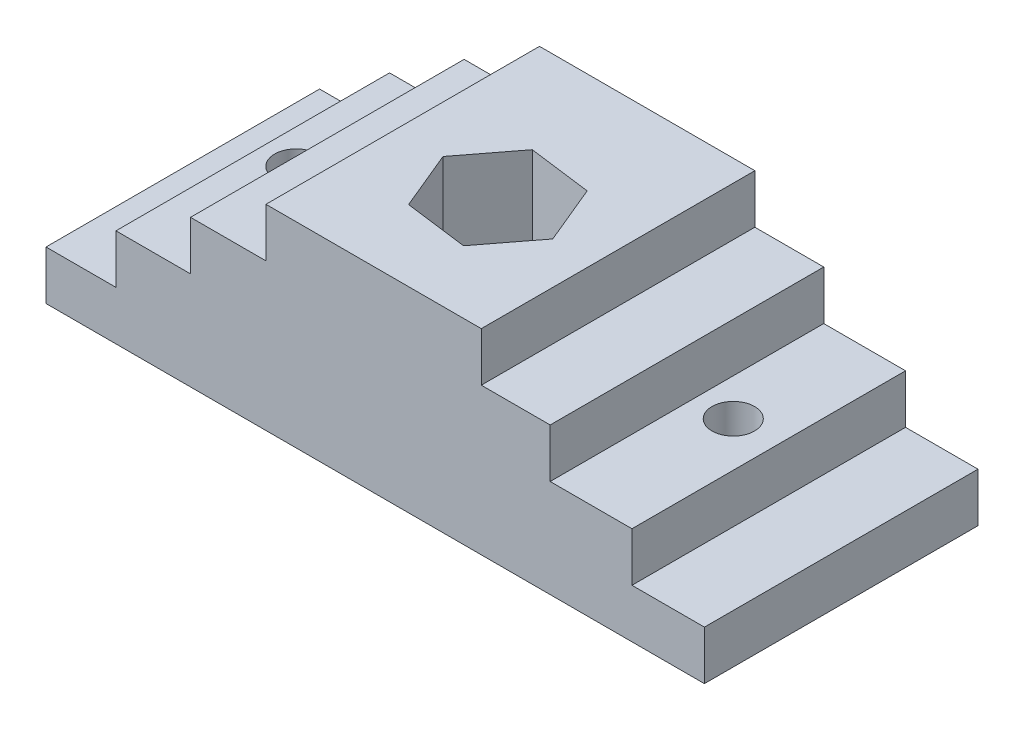
ISO-10303-21;
HEADER;
FILE_DESCRIPTION(('STEP AP214'),'2;1');
FILE_NAME('part.step','',(''),(''),'','','');
FILE_SCHEMA(('AUTOMOTIVE_DESIGN { 1 0 10303 214 1 1 1 1 }'));
ENDSEC;
DATA;
#1=APPLICATION_CONTEXT('core data for automotive mechanical design processes');
#2=APPLICATION_PROTOCOL_DEFINITION('international standard','automotive_design',2000,#1);
#3=PRODUCT_CONTEXT('',#1,'mechanical');
#4=PRODUCT('Part','Part','',(#3));
#5=PRODUCT_RELATED_PRODUCT_CATEGORY('part','',(#4));
#6=PRODUCT_DEFINITION_FORMATION('','',#4);
#7=PRODUCT_DEFINITION_CONTEXT('part definition',#1,'design');
#8=PRODUCT_DEFINITION('design','',#6,#7);
#9=PRODUCT_DEFINITION_SHAPE('','',#8);
#10=(LENGTH_UNIT() NAMED_UNIT(*) SI_UNIT(.MILLI.,.METRE.));
#11=(NAMED_UNIT(*) PLANE_ANGLE_UNIT() SI_UNIT($,.RADIAN.));
#12=(NAMED_UNIT(*) SI_UNIT($,.STERADIAN.) SOLID_ANGLE_UNIT());
#13=UNCERTAINTY_MEASURE_WITH_UNIT(LENGTH_MEASURE(1.E-05),#10,'distance_accuracy_value','');
#14=(GEOMETRIC_REPRESENTATION_CONTEXT(3) GLOBAL_UNCERTAINTY_ASSIGNED_CONTEXT((#13)) GLOBAL_UNIT_ASSIGNED_CONTEXT((#10,
#11,#12)) REPRESENTATION_CONTEXT('',''));
#15=CARTESIAN_POINT('',(0.,0.,0.));
#16=DIRECTION('',(0.,0.,1.));
#17=DIRECTION('',(1.,0.,0.));
#18=AXIS2_PLACEMENT_3D('',#15,#16,#17);
#19=CARTESIAN_POINT('',(0.,60.,0.));
#20=DIRECTION('',(0.,1.,0.));
#21=DIRECTION('',(0.,0.,1.));
#22=AXIS2_PLACEMENT_3D('',#19,#20,#21);
#23=PLANE('',#22);
#24=DIRECTION('',(0.,0.,1.));
#25=VECTOR('',#24,1.);
#26=CARTESIAN_POINT('',(-31.7393175950065,60.,-55.0411341898475));
#27=LINE('',#26,#25);
#28=CARTESIAN_POINT('',(-31.7393175950065,60.,-55.0411341898475));
#29=VERTEX_POINT('',#28);
#30=CARTESIAN_POINT('',(-31.7393175950065,60.,56.6780452438207));
#31=VERTEX_POINT('',#30);
#32=EDGE_CURVE('E243',#29,#31,#27,.T.);
#33=ORIENTED_EDGE('',*,*,#32,.F.);
#34=DIRECTION('',(-1.,0.,0.));
#35=VECTOR('',#34,1.);
#36=CARTESIAN_POINT('',(-62.5244053726272,60.,-55.0411341898475));
#37=LINE('',#36,#35);
#38=CARTESIAN_POINT('',(-62.5244053726272,60.,-55.0411341898475));
#39=VERTEX_POINT('',#38);
#40=EDGE_CURVE('E282',#29,#39,#37,.T.);
#41=ORIENTED_EDGE('',*,*,#40,.T.);
#42=DIRECTION('',(0.,0.,1.));
#43=VECTOR('',#42,1.);
#44=CARTESIAN_POINT('',(-62.5244053726272,60.,-55.0411341898475));
#45=LINE('',#44,#43);
#46=CARTESIAN_POINT('',(-62.5244053726272,60.,56.6780452438207));
#47=VERTEX_POINT('',#46);
#48=EDGE_CURVE('E273',#39,#47,#45,.T.);
#49=ORIENTED_EDGE('',*,*,#48,.T.);
#50=DIRECTION('',(1.,0.,0.));
#51=VECTOR('',#50,1.);
#52=CARTESIAN_POINT('',(-62.5244053726272,60.,56.6780452438207));
#53=LINE('',#52,#51);
#54=EDGE_CURVE('E278',#47,#31,#53,.T.);
#55=ORIENTED_EDGE('',*,*,#54,.T.);
#56=EDGE_LOOP('',(#33,#41,#49,#55));
#57=FACE_BOUND('',#56,.T.);
#58=ADVANCED_FACE('F32',(#57),#23,.T.);
#59=CARTESIAN_POINT('',(0.,40.,0.));
#60=DIRECTION('',(0.,1.,0.));
#61=DIRECTION('',(0.,0.,1.));
#62=AXIS2_PLACEMENT_3D('',#59,#60,#61);
#63=PLANE('',#62);
#64=CARTESIAN_POINT('',(-78.9946033956425,40.,-2.9007104851005));
#65=DIRECTION('',(0.,1.,0.));
#66=DIRECTION('',(0.,0.,1.));
#67=AXIS2_PLACEMENT_3D('',#64,#65,#66);
#68=CIRCLE('',#67,8.75097885196963);
#69=CARTESIAN_POINT('',(-78.9946033956425,40.,5.85026836686913));
#70=VERTEX_POINT('',#69);
#71=EDGE_CURVE('E237',#70,#70,#68,.T.);
#72=ORIENTED_EDGE('',*,*,#71,.F.);
#73=EDGE_LOOP('',(#72));
#74=FACE_BOUND('',#73,.T.);
#75=DIRECTION('',(0.,0.,1.));
#76=VECTOR('',#75,1.);
#77=CARTESIAN_POINT('',(-62.5244053726272,40.,-55.0411341898475));
#78=LINE('',#77,#76);
#79=CARTESIAN_POINT('',(-62.5244053726272,40.,-55.0411341898475));
#80=VERTEX_POINT('',#79);
#81=CARTESIAN_POINT('',(-62.5244053726272,40.,56.6780452438207));
#82=VERTEX_POINT('',#81);
#83=EDGE_CURVE('E272',#80,#82,#78,.T.);
#84=ORIENTED_EDGE('',*,*,#83,.F.);
#85=DIRECTION('',(-1.,0.,0.));
#86=VECTOR('',#85,1.);
#87=CARTESIAN_POINT('',(-92.976988235667,40.,-55.0411341898475));
#88=LINE('',#87,#86);
#89=CARTESIAN_POINT('',(-92.976988235667,40.,-55.0411341898475));
#90=VERTEX_POINT('',#89);
#91=EDGE_CURVE('E311',#80,#90,#88,.T.);
#92=ORIENTED_EDGE('',*,*,#91,.T.);
#93=DIRECTION('',(0.,0.,1.));
#94=VECTOR('',#93,1.);
#95=CARTESIAN_POINT('',(-92.976988235667,40.,-55.0411341898475));
#96=LINE('',#95,#94);
#97=CARTESIAN_POINT('',(-92.976988235667,40.,56.6780452438207));
#98=VERTEX_POINT('',#97);
#99=EDGE_CURVE('E302',#90,#98,#96,.T.);
#100=ORIENTED_EDGE('',*,*,#99,.T.);
#101=DIRECTION('',(1.,0.,0.));
#102=VECTOR('',#101,1.);
#103=CARTESIAN_POINT('',(-92.976988235667,40.,56.6780452438207));
#104=LINE('',#103,#102);
#105=EDGE_CURVE('E307',#98,#82,#104,.T.);
#106=ORIENTED_EDGE('',*,*,#105,.T.);
#107=EDGE_LOOP('',(#84,#92,#100,#106));
#108=FACE_BOUND('',#107,.T.);
#109=ADVANCED_FACE('F384',(#74,#108),#63,.T.);
#110=CARTESIAN_POINT('',(0.,20.,0.));
#111=DIRECTION('',(0.,1.,0.));
#112=DIRECTION('',(0.,0.,1.));
#113=AXIS2_PLACEMENT_3D('',#110,#111,#112);
#114=PLANE('',#113);
#115=DIRECTION('',(0.,0.,1.));
#116=VECTOR('',#115,1.);
#117=CARTESIAN_POINT('',(-92.976988235667,20.,-55.0411341898475));
#118=LINE('',#117,#116);
#119=CARTESIAN_POINT('',(-92.976988235667,20.,-55.0411341898475));
#120=VERTEX_POINT('',#119);
#121=CARTESIAN_POINT('',(-92.976988235667,20.,56.6780452438207));
#122=VERTEX_POINT('',#121);
#123=EDGE_CURVE('E301',#120,#122,#118,.T.);
#124=ORIENTED_EDGE('',*,*,#123,.F.);
#125=DIRECTION('',(-1.,0.,0.));
#126=VECTOR('',#125,1.);
#127=CARTESIAN_POINT('',(-121.540645757507,20.,-55.0411341898475));
#128=LINE('',#127,#126);
#129=CARTESIAN_POINT('',(-121.540645757507,20.,-55.0411341898475));
#130=VERTEX_POINT('',#129);
#131=EDGE_CURVE('E340',#120,#130,#128,.T.);
#132=ORIENTED_EDGE('',*,*,#131,.T.);
#133=DIRECTION('',(0.,0.,1.));
#134=VECTOR('',#133,1.);
#135=CARTESIAN_POINT('',(-121.540645757507,20.,-55.0411341898475));
#136=LINE('',#135,#134);
#137=CARTESIAN_POINT('',(-121.540645757507,20.,56.6780452438207));
#138=VERTEX_POINT('',#137);
#139=EDGE_CURVE('E331',#130,#138,#136,.T.);
#140=ORIENTED_EDGE('',*,*,#139,.T.);
#141=DIRECTION('',(1.,0.,0.));
#142=VECTOR('',#141,1.);
#143=CARTESIAN_POINT('',(-121.540645757507,20.,56.6780452438207));
#144=LINE('',#143,#142);
#145=EDGE_CURVE('E336',#138,#122,#144,.T.);
#146=ORIENTED_EDGE('',*,*,#145,.T.);
#147=EDGE_LOOP('',(#124,#132,#140,#146));
#148=FACE_BOUND('',#147,.T.);
#149=ADVANCED_FACE('F376',(#148),#114,.T.);
#150=CARTESIAN_POINT('',(-121.540645757507,20.,-55.0411341898475));
#151=DIRECTION('',(1.,0.,0.));
#152=DIRECTION('',(0.,0.,-1.));
#153=AXIS2_PLACEMENT_3D('',#150,#151,#152);
#154=PLANE('',#153);
#155=DIRECTION('',(0.,0.,1.));
#156=VECTOR('',#155,1.);
#157=CARTESIAN_POINT('',(-121.540645757507,0.,-55.0411341898475));
#158=LINE('',#157,#156);
#159=CARTESIAN_POINT('',(-121.540645757507,0.,-55.0411341898475));
#160=VERTEX_POINT('',#159);
#161=CARTESIAN_POINT('',(-121.540645757507,0.,56.6780452438207));
#162=VERTEX_POINT('',#161);
#163=EDGE_CURVE('E330',#160,#162,#158,.T.);
#164=ORIENTED_EDGE('',*,*,#163,.T.);
#165=DIRECTION('',(0.,-1.,0.));
#166=VECTOR('',#165,1.);
#167=CARTESIAN_POINT('',(-121.540645757507,20.,56.6780452438207));
#168=LINE('',#167,#166);
#169=EDGE_CURVE('E11',#138,#162,#168,.T.);
#170=ORIENTED_EDGE('',*,*,#169,.F.);
#171=ORIENTED_EDGE('',*,*,#139,.F.);
#172=DIRECTION('',(0.,-1.,0.));
#173=VECTOR('',#172,1.);
#174=CARTESIAN_POINT('',(-121.540645757507,20.,-55.0411341898475));
#175=LINE('',#174,#173);
#176=EDGE_CURVE('E343',#130,#160,#175,.T.);
#177=ORIENTED_EDGE('',*,*,#176,.T.);
#178=EDGE_LOOP('',(#164,#170,#171,#177));
#179=FACE_BOUND('',#178,.T.);
#180=ADVANCED_FACE('F34',(#179),#154,.F.);
#181=CARTESIAN_POINT('',(-121.540645757507,20.,56.6780452438207));
#182=DIRECTION('',(0.,0.,-1.));
#183=DIRECTION('',(-1.,0.,0.));
#184=AXIS2_PLACEMENT_3D('',#181,#182,#183);
#185=PLANE('',#184);
#186=DIRECTION('',(1.,0.,0.));
#187=VECTOR('',#186,1.);
#188=CARTESIAN_POINT('',(-121.540645757507,0.,56.6780452438207));
#189=LINE('',#188,#187);
#190=CARTESIAN_POINT('',(147.321994857585,0.,56.6780452438207));
#191=VERTEX_POINT('',#190);
#192=EDGE_CURVE('E346',#162,#191,#189,.T.);
#193=ORIENTED_EDGE('',*,*,#192,.T.);
#194=DIRECTION('',(0.,-1.,0.));
#195=VECTOR('',#194,1.);
#196=CARTESIAN_POINT('',(147.321994857585,20.,56.6780452438207));
#197=LINE('',#196,#195);
#198=CARTESIAN_POINT('',(147.321994857585,20.,56.6780452438207));
#199=VERTEX_POINT('',#198);
#200=EDGE_CURVE('E40',#199,#191,#197,.T.);
#201=ORIENTED_EDGE('',*,*,#200,.F.);
#202=CARTESIAN_POINT('',(117.735238348915,20.,56.6780452438207));
#203=VERTEX_POINT('',#202);
#204=EDGE_CURVE('E334',#203,#199,#144,.T.);
#205=ORIENTED_EDGE('',*,*,#204,.F.);
#206=DIRECTION('',(0.,-1.,0.));
#207=VECTOR('',#206,1.);
#208=CARTESIAN_POINT('',(117.735238348915,40.,56.6780452438207));
#209=LINE('',#208,#207);
#210=CARTESIAN_POINT('',(117.735238348915,40.,56.6780452438207));
#211=VERTEX_POINT('',#210);
#212=EDGE_CURVE('E324',#211,#203,#209,.T.);
#213=ORIENTED_EDGE('',*,*,#212,.F.);
#214=CARTESIAN_POINT('',(84.335631337839,40.,56.6780452438207));
#215=VERTEX_POINT('',#214);
#216=EDGE_CURVE('E305',#215,#211,#104,.T.);
#217=ORIENTED_EDGE('',*,*,#216,.F.);
#218=DIRECTION('',(0.,-1.,0.));
#219=VECTOR('',#218,1.);
#220=CARTESIAN_POINT('',(84.335631337839,60.,56.6780452438207));
#221=LINE('',#220,#219);
#222=CARTESIAN_POINT('',(84.335631337839,60.,56.6780452438207));
#223=VERTEX_POINT('',#222);
#224=EDGE_CURVE('E295',#223,#215,#221,.T.);
#225=ORIENTED_EDGE('',*,*,#224,.F.);
#226=CARTESIAN_POINT('',(56.2080198672883,60.,56.6780452438207));
#227=VERTEX_POINT('',#226);
#228=EDGE_CURVE('E276',#227,#223,#53,.T.);
#229=ORIENTED_EDGE('',*,*,#228,.F.);
#230=DIRECTION('',(0.,-1.,0.));
#231=VECTOR('',#230,1.);
#232=CARTESIAN_POINT('',(56.2080198672883,80.,56.6780452438207));
#233=LINE('',#232,#231);
#234=CARTESIAN_POINT('',(56.2080198672883,80.,56.6780452438207));
#235=VERTEX_POINT('',#234);
#236=EDGE_CURVE('E266',#235,#227,#233,.T.);
#237=ORIENTED_EDGE('',*,*,#236,.F.);
#238=DIRECTION('',(1.,0.,0.));
#239=VECTOR('',#238,1.);
#240=CARTESIAN_POINT('',(-31.7393175950065,80.,56.6780452438207));
#241=LINE('',#240,#239);
#242=CARTESIAN_POINT('',(-31.7393175950065,80.,56.6780452438207));
#243=VERTEX_POINT('',#242);
#244=EDGE_CURVE('E249',#243,#235,#241,.T.);
#245=ORIENTED_EDGE('',*,*,#244,.F.);
#246=DIRECTION('',(0.,-1.,0.));
#247=VECTOR('',#246,1.);
#248=CARTESIAN_POINT('',(-31.7393175950065,80.,56.6780452438207));
#249=LINE('',#248,#247);
#250=EDGE_CURVE('E269',#243,#31,#249,.T.);
#251=ORIENTED_EDGE('',*,*,#250,.T.);
#252=ORIENTED_EDGE('',*,*,#54,.F.);
#253=DIRECTION('',(0.,-1.,0.));
#254=VECTOR('',#253,1.);
#255=CARTESIAN_POINT('',(-62.5244053726272,60.,56.6780452438207));
#256=LINE('',#255,#254);
#257=EDGE_CURVE('E298',#47,#82,#256,.T.);
#258=ORIENTED_EDGE('',*,*,#257,.T.);
#259=ORIENTED_EDGE('',*,*,#105,.F.);
#260=DIRECTION('',(0.,-1.,0.));
#261=VECTOR('',#260,1.);
#262=CARTESIAN_POINT('',(-92.976988235667,40.,56.6780452438207));
#263=LINE('',#262,#261);
#264=EDGE_CURVE('E327',#98,#122,#263,.T.);
#265=ORIENTED_EDGE('',*,*,#264,.T.);
#266=ORIENTED_EDGE('',*,*,#145,.F.);
#267=ORIENTED_EDGE('',*,*,#169,.T.);
#268=EDGE_LOOP('',(#193,#201,#205,#213,#217,#225,#229,#237,#245,#251,#252,#258,#259,#265,#266,#267));
#269=FACE_BOUND('',#268,.T.);
#270=ADVANCED_FACE('F410',(#269),#185,.F.);
#271=CARTESIAN_POINT('',(147.321994857585,20.,-55.0411341898475));
#272=DIRECTION('',(-1.,0.,0.));
#273=DIRECTION('',(0.,0.,1.));
#274=AXIS2_PLACEMENT_3D('',#271,#272,#273);
#275=PLANE('',#274);
#276=DIRECTION('',(0.,0.,-1.));
#277=VECTOR('',#276,1.);
#278=CARTESIAN_POINT('',(147.321994857585,0.,-55.0411341898475));
#279=LINE('',#278,#277);
#280=CARTESIAN_POINT('',(147.321994857585,0.,-55.0411341898475));
#281=VERTEX_POINT('',#280);
#282=EDGE_CURVE('E348',#191,#281,#279,.T.);
#283=ORIENTED_EDGE('',*,*,#282,.T.);
#284=DIRECTION('',(0.,-1.,0.));
#285=VECTOR('',#284,1.);
#286=CARTESIAN_POINT('',(147.321994857585,20.,-55.0411341898475));
#287=LINE('',#286,#285);
#288=CARTESIAN_POINT('',(147.321994857585,20.,-55.0411341898475));
#289=VERTEX_POINT('',#288);
#290=EDGE_CURVE('E353',#289,#281,#287,.T.);
#291=ORIENTED_EDGE('',*,*,#290,.F.);
#292=DIRECTION('',(0.,0.,-1.));
#293=VECTOR('',#292,1.);
#294=CARTESIAN_POINT('',(147.321994857585,20.,-55.0411341898475));
#295=LINE('',#294,#293);
#296=EDGE_CURVE('E338',#199,#289,#295,.T.);
#297=ORIENTED_EDGE('',*,*,#296,.F.);
#298=ORIENTED_EDGE('',*,*,#200,.T.);
#299=EDGE_LOOP('',(#283,#291,#297,#298));
#300=FACE_BOUND('',#299,.T.);
#301=ADVANCED_FACE('F360',(#300),#275,.F.);
#302=CARTESIAN_POINT('',(-121.540645757507,20.,-55.0411341898475));
#303=DIRECTION('',(0.,0.,1.));
#304=DIRECTION('',(1.,0.,0.));
#305=AXIS2_PLACEMENT_3D('',#302,#303,#304);
#306=PLANE('',#305);
#307=DIRECTION('',(-1.,0.,0.));
#308=VECTOR('',#307,1.);
#309=CARTESIAN_POINT('',(-121.540645757507,0.,-55.0411341898475));
#310=LINE('',#309,#308);
#311=EDGE_CURVE('E335',#281,#160,#310,.T.);
#312=ORIENTED_EDGE('',*,*,#311,.T.);
#313=ORIENTED_EDGE('',*,*,#176,.F.);
#314=ORIENTED_EDGE('',*,*,#131,.F.);
#315=DIRECTION('',(0.,-1.,0.));
#316=VECTOR('',#315,1.);
#317=CARTESIAN_POINT('',(-92.976988235667,40.,-55.0411341898475));
#318=LINE('',#317,#316);
#319=EDGE_CURVE('E314',#90,#120,#318,.T.);
#320=ORIENTED_EDGE('',*,*,#319,.F.);
#321=ORIENTED_EDGE('',*,*,#91,.F.);
#322=DIRECTION('',(0.,-1.,0.));
#323=VECTOR('',#322,1.);
#324=CARTESIAN_POINT('',(-62.5244053726272,60.,-55.0411341898475));
#325=LINE('',#324,#323);
#326=EDGE_CURVE('E285',#39,#80,#325,.T.);
#327=ORIENTED_EDGE('',*,*,#326,.F.);
#328=ORIENTED_EDGE('',*,*,#40,.F.);
#329=DIRECTION('',(0.,-1.,0.));
#330=VECTOR('',#329,1.);
#331=CARTESIAN_POINT('',(-31.7393175950065,80.,-55.0411341898475));
#332=LINE('',#331,#330);
#333=CARTESIAN_POINT('',(-31.7393175950065,80.,-55.0411341898475));
#334=VERTEX_POINT('',#333);
#335=EDGE_CURVE('E256',#334,#29,#332,.T.);
#336=ORIENTED_EDGE('',*,*,#335,.F.);
#337=DIRECTION('',(-1.,0.,0.));
#338=VECTOR('',#337,1.);
#339=CARTESIAN_POINT('',(-31.7393175950065,80.,-55.0411341898475));
#340=LINE('',#339,#338);
#341=CARTESIAN_POINT('',(56.2080198672883,80.,-55.0411341898475));
#342=VERTEX_POINT('',#341);
#343=EDGE_CURVE('E254',#342,#334,#340,.T.);
#344=ORIENTED_EDGE('',*,*,#343,.F.);
#345=DIRECTION('',(0.,-1.,0.));
#346=VECTOR('',#345,1.);
#347=CARTESIAN_POINT('',(56.2080198672883,80.,-55.0411341898475));
#348=LINE('',#347,#346);
#349=CARTESIAN_POINT('',(56.2080198672883,60.,-55.0411341898475));
#350=VERTEX_POINT('',#349);
#351=EDGE_CURVE('E263',#342,#350,#348,.T.);
#352=ORIENTED_EDGE('',*,*,#351,.T.);
#353=CARTESIAN_POINT('',(84.335631337839,60.,-55.0411341898475));
#354=VERTEX_POINT('',#353);
#355=EDGE_CURVE('E283',#354,#350,#37,.T.);
#356=ORIENTED_EDGE('',*,*,#355,.F.);
#357=DIRECTION('',(0.,-1.,0.));
#358=VECTOR('',#357,1.);
#359=CARTESIAN_POINT('',(84.335631337839,60.,-55.0411341898475));
#360=LINE('',#359,#358);
#361=CARTESIAN_POINT('',(84.335631337839,40.,-55.0411341898475));
#362=VERTEX_POINT('',#361);
#363=EDGE_CURVE('E292',#354,#362,#360,.T.);
#364=ORIENTED_EDGE('',*,*,#363,.T.);
#365=CARTESIAN_POINT('',(117.735238348915,40.,-55.0411341898475));
#366=VERTEX_POINT('',#365);
#367=EDGE_CURVE('E312',#366,#362,#88,.T.);
#368=ORIENTED_EDGE('',*,*,#367,.F.);
#369=DIRECTION('',(0.,-1.,0.));
#370=VECTOR('',#369,1.);
#371=CARTESIAN_POINT('',(117.735238348915,40.,-55.0411341898475));
#372=LINE('',#371,#370);
#373=CARTESIAN_POINT('',(117.735238348915,20.,-55.0411341898475));
#374=VERTEX_POINT('',#373);
#375=EDGE_CURVE('E321',#366,#374,#372,.T.);
#376=ORIENTED_EDGE('',*,*,#375,.T.);
#377=EDGE_CURVE('E341',#289,#374,#128,.T.);
#378=ORIENTED_EDGE('',*,*,#377,.F.);
#379=ORIENTED_EDGE('',*,*,#290,.T.);
#380=EDGE_LOOP('',(#312,#313,#314,#320,#321,#327,#328,#336,#344,#352,#356,#364,#368,#376,#378,#379));
#381=FACE_BOUND('',#380,.T.);
#382=ADVANCED_FACE('F369',(#381),#306,.F.);
#383=DIRECTION('',(0.,0.,-1.));
#384=VECTOR('',#383,1.);
#385=CARTESIAN_POINT('',(117.735238348915,20.,-55.0411341898475));
#386=LINE('',#385,#384);
#387=EDGE_CURVE('E306',#203,#374,#386,.T.);
#388=ORIENTED_EDGE('',*,*,#387,.F.);
#389=ORIENTED_EDGE('',*,*,#204,.T.);
#390=ORIENTED_EDGE('',*,*,#296,.T.);
#391=ORIENTED_EDGE('',*,*,#377,.T.);
#392=EDGE_LOOP('',(#388,#389,#390,#391));
#393=FACE_BOUND('',#392,.T.);
#394=ADVANCED_FACE('F425',(#393),#114,.T.);
#395=CARTESIAN_POINT('',(0.,0.,0.));
#396=DIRECTION('',(0.,1.,0.));
#397=DIRECTION('',(0.,0.,1.));
#398=AXIS2_PLACEMENT_3D('',#395,#396,#397);
#399=PLANE('',#398);
#400=DIRECTION('',(0.383186219765692,0.,0.923671110829866));
#401=VECTOR('',#400,1.);
#402=CARTESIAN_POINT('',(-12.4827878350212,0.,3.61732131531862));
#403=LINE('',#402,#401);
#404=CARTESIAN_POINT('',(-12.4827878350212,0.,3.61732131531862));
#405=VERTEX_POINT('',#404);
#406=CARTESIAN_POINT('',(-2.51866027151981,0.,27.6358697397833));
#407=VERTEX_POINT('',#406);
#408=EDGE_CURVE('E189',#405,#407,#403,.T.);
#409=ORIENTED_EDGE('',*,*,#408,.T.);
#410=DIRECTION('',(0.991515756603302,0.,0.129986554717717));
#411=VECTOR('',#410,1.);
#412=CARTESIAN_POINT('',(-2.51866027151981,0.,27.6358697397833));
#413=LINE('',#412,#411);
#414=CARTESIAN_POINT('',(23.264076607844,0.,31.0159563554747));
#415=VERTEX_POINT('',#414);
#416=EDGE_CURVE('E183',#407,#415,#413,.T.);
#417=ORIENTED_EDGE('',*,*,#416,.T.);
#418=DIRECTION('',(0.60832953683761,0.,-0.793684556112149));
#419=VECTOR('',#418,1.);
#420=CARTESIAN_POINT('',(23.264076607844,0.,31.0159563554747));
#421=LINE('',#420,#419);
#422=CARTESIAN_POINT('',(39.0826859237064,0.,10.3774945467014));
#423=VERTEX_POINT('',#422);
#424=EDGE_CURVE('E192',#415,#423,#421,.T.);
#425=ORIENTED_EDGE('',*,*,#424,.T.);
#426=DIRECTION('',(-0.383186219765692,0.,-0.923671110829866));
#427=VECTOR('',#426,1.);
#428=CARTESIAN_POINT('',(39.0826859237065,0.,10.3774945467014));
#429=LINE('',#428,#427);
#430=CARTESIAN_POINT('',(29.118558360205,0.,-13.6410538777633));
#431=VERTEX_POINT('',#430);
#432=EDGE_CURVE('E47',#423,#431,#429,.T.);
#433=ORIENTED_EDGE('',*,*,#432,.T.);
#434=DIRECTION('',(-0.991515756603302,0.,-0.129986554717717));
#435=VECTOR('',#434,1.);
#436=CARTESIAN_POINT('',(29.118558360205,0.,-13.6410538777633));
#437=LINE('',#436,#435);
#438=CARTESIAN_POINT('',(3.3358214808412,0.,-17.0211404934547));
#439=VERTEX_POINT('',#438);
#440=EDGE_CURVE('E207',#431,#439,#437,.T.);
#441=ORIENTED_EDGE('',*,*,#440,.T.);
#442=DIRECTION('',(-0.60832953683761,0.,0.793684556112149));
#443=VECTOR('',#442,1.);
#444=CARTESIAN_POINT('',(3.3358214808412,0.,-17.0211404934547));
#445=LINE('',#444,#443);
#446=EDGE_CURVE('E210',#439,#405,#445,.T.);
#447=ORIENTED_EDGE('',*,*,#446,.T.);
#448=EDGE_LOOP('',(#409,#417,#425,#433,#441,#447));
#449=FACE_BOUND('',#448,.T.);
#450=CARTESIAN_POINT('',(99.5253651845381,0.,-2.9007104851005));
#451=DIRECTION('',(0.,1.,0.));
#452=DIRECTION('',(0.,0.,1.));
#453=AXIS2_PLACEMENT_3D('',#450,#451,#452);
#454=CIRCLE('',#453,8.68509852590086);
#455=CARTESIAN_POINT('',(99.5253651845381,0.,5.78438804080035));
#456=VERTEX_POINT('',#455);
#457=EDGE_CURVE('E234',#456,#456,#454,.T.);
#458=ORIENTED_EDGE('',*,*,#457,.T.);
#459=EDGE_LOOP('',(#458));
#460=FACE_BOUND('',#459,.T.);
#461=CARTESIAN_POINT('',(-78.9946033956425,0.,-2.9007104851005));
#462=DIRECTION('',(0.,1.,0.));
#463=DIRECTION('',(0.,0.,1.));
#464=AXIS2_PLACEMENT_3D('',#461,#462,#463);
#465=CIRCLE('',#464,8.75097885196963);
#466=CARTESIAN_POINT('',(-78.9946033956425,0.,5.85026836686913));
#467=VERTEX_POINT('',#466);
#468=EDGE_CURVE('E240',#467,#467,#465,.T.);
#469=ORIENTED_EDGE('',*,*,#468,.T.);
#470=EDGE_LOOP('',(#469));
#471=FACE_BOUND('',#470,.T.);
#472=ORIENTED_EDGE('',*,*,#163,.F.);
#473=ORIENTED_EDGE('',*,*,#311,.F.);
#474=ORIENTED_EDGE('',*,*,#282,.F.);
#475=ORIENTED_EDGE('',*,*,#192,.F.);
#476=EDGE_LOOP('',(#472,#473,#474,#475));
#477=FACE_BOUND('',#476,.T.);
#478=ADVANCED_FACE('F196',(#449,#460,#471,#477),#399,.F.);
#479=CARTESIAN_POINT('',(-92.976988235667,40.,-55.0411341898475));
#480=DIRECTION('',(1.,0.,0.));
#481=DIRECTION('',(0.,0.,-1.));
#482=AXIS2_PLACEMENT_3D('',#479,#480,#481);
#483=PLANE('',#482);
#484=ORIENTED_EDGE('',*,*,#123,.T.);
#485=ORIENTED_EDGE('',*,*,#264,.F.);
#486=ORIENTED_EDGE('',*,*,#99,.F.);
#487=ORIENTED_EDGE('',*,*,#319,.T.);
#488=EDGE_LOOP('',(#484,#485,#486,#487));
#489=FACE_BOUND('',#488,.T.);
#490=ADVANCED_FACE('F381',(#489),#483,.F.);
#491=CARTESIAN_POINT('',(117.735238348915,40.,-55.0411341898475));
#492=DIRECTION('',(-1.,0.,0.));
#493=DIRECTION('',(0.,0.,1.));
#494=AXIS2_PLACEMENT_3D('',#491,#492,#493);
#495=PLANE('',#494);
#496=ORIENTED_EDGE('',*,*,#387,.T.);
#497=ORIENTED_EDGE('',*,*,#375,.F.);
#498=DIRECTION('',(0.,0.,-1.));
#499=VECTOR('',#498,1.);
#500=CARTESIAN_POINT('',(117.735238348915,40.,-55.0411341898475));
#501=LINE('',#500,#499);
#502=EDGE_CURVE('E309',#211,#366,#501,.T.);
#503=ORIENTED_EDGE('',*,*,#502,.F.);
#504=ORIENTED_EDGE('',*,*,#212,.T.);
#505=EDGE_LOOP('',(#496,#497,#503,#504));
#506=FACE_BOUND('',#505,.T.);
#507=ADVANCED_FACE('F423',(#506),#495,.F.);
#508=CARTESIAN_POINT('',(99.5253651845381,40.,-2.9007104851005));
#509=DIRECTION('',(0.,1.,0.));
#510=DIRECTION('',(0.,0.,1.));
#511=AXIS2_PLACEMENT_3D('',#508,#509,#510);
#512=CIRCLE('',#511,8.68509852590086);
#513=CARTESIAN_POINT('',(99.5253651845381,40.,5.78438804080035));
#514=VERTEX_POINT('',#513);
#515=EDGE_CURVE('E226',#514,#514,#512,.T.);
#516=ORIENTED_EDGE('',*,*,#515,.F.);
#517=EDGE_LOOP('',(#516));
#518=FACE_BOUND('',#517,.T.);
#519=DIRECTION('',(0.,0.,-1.));
#520=VECTOR('',#519,1.);
#521=CARTESIAN_POINT('',(84.335631337839,40.,-55.0411341898475));
#522=LINE('',#521,#520);
#523=EDGE_CURVE('E277',#215,#362,#522,.T.);
#524=ORIENTED_EDGE('',*,*,#523,.F.);
#525=ORIENTED_EDGE('',*,*,#216,.T.);
#526=ORIENTED_EDGE('',*,*,#502,.T.);
#527=ORIENTED_EDGE('',*,*,#367,.T.);
#528=EDGE_LOOP('',(#524,#525,#526,#527));
#529=FACE_BOUND('',#528,.T.);
#530=ADVANCED_FACE('F420',(#518,#529),#63,.T.);
#531=CARTESIAN_POINT('',(-62.5244053726272,60.,-55.0411341898475));
#532=DIRECTION('',(1.,0.,0.));
#533=DIRECTION('',(0.,0.,-1.));
#534=AXIS2_PLACEMENT_3D('',#531,#532,#533);
#535=PLANE('',#534);
#536=ORIENTED_EDGE('',*,*,#83,.T.);
#537=ORIENTED_EDGE('',*,*,#257,.F.);
#538=ORIENTED_EDGE('',*,*,#48,.F.);
#539=ORIENTED_EDGE('',*,*,#326,.T.);
#540=EDGE_LOOP('',(#536,#537,#538,#539));
#541=FACE_BOUND('',#540,.T.);
#542=ADVANCED_FACE('F389',(#541),#535,.F.);
#543=CARTESIAN_POINT('',(84.335631337839,60.,-55.0411341898475));
#544=DIRECTION('',(-1.,0.,0.));
#545=DIRECTION('',(0.,0.,1.));
#546=AXIS2_PLACEMENT_3D('',#543,#544,#545);
#547=PLANE('',#546);
#548=ORIENTED_EDGE('',*,*,#523,.T.);
#549=ORIENTED_EDGE('',*,*,#363,.F.);
#550=DIRECTION('',(0.,0.,-1.));
#551=VECTOR('',#550,1.);
#552=CARTESIAN_POINT('',(84.335631337839,60.,-55.0411341898475));
#553=LINE('',#552,#551);
#554=EDGE_CURVE('E280',#223,#354,#553,.T.);
#555=ORIENTED_EDGE('',*,*,#554,.F.);
#556=ORIENTED_EDGE('',*,*,#224,.T.);
#557=EDGE_LOOP('',(#548,#549,#555,#556));
#558=FACE_BOUND('',#557,.T.);
#559=ADVANCED_FACE('F416',(#558),#547,.F.);
#560=DIRECTION('',(0.,0.,-1.));
#561=VECTOR('',#560,1.);
#562=CARTESIAN_POINT('',(56.2080198672883,60.,-55.0411341898475));
#563=LINE('',#562,#561);
#564=EDGE_CURVE('E250',#227,#350,#563,.T.);
#565=ORIENTED_EDGE('',*,*,#564,.F.);
#566=ORIENTED_EDGE('',*,*,#228,.T.);
#567=ORIENTED_EDGE('',*,*,#554,.T.);
#568=ORIENTED_EDGE('',*,*,#355,.T.);
#569=EDGE_LOOP('',(#565,#566,#567,#568));
#570=FACE_BOUND('',#569,.T.);
#571=ADVANCED_FACE('F408',(#570),#23,.T.);
#572=CARTESIAN_POINT('',(-31.7393175950065,80.,-55.0411341898475));
#573=DIRECTION('',(1.,0.,0.));
#574=DIRECTION('',(0.,0.,-1.));
#575=AXIS2_PLACEMENT_3D('',#572,#573,#574);
#576=PLANE('',#575);
#577=ORIENTED_EDGE('',*,*,#32,.T.);
#578=ORIENTED_EDGE('',*,*,#250,.F.);
#579=DIRECTION('',(0.,0.,1.));
#580=VECTOR('',#579,1.);
#581=CARTESIAN_POINT('',(-31.7393175950065,80.,-55.0411341898475));
#582=LINE('',#581,#580);
#583=EDGE_CURVE('E246',#334,#243,#582,.T.);
#584=ORIENTED_EDGE('',*,*,#583,.F.);
#585=ORIENTED_EDGE('',*,*,#335,.T.);
#586=EDGE_LOOP('',(#577,#578,#584,#585));
#587=FACE_BOUND('',#586,.T.);
#588=ADVANCED_FACE('F396',(#587),#576,.F.);
#589=CARTESIAN_POINT('',(56.2080198672883,80.,-55.0411341898475));
#590=DIRECTION('',(-1.,0.,0.));
#591=DIRECTION('',(0.,0.,1.));
#592=AXIS2_PLACEMENT_3D('',#589,#590,#591);
#593=PLANE('',#592);
#594=ORIENTED_EDGE('',*,*,#564,.T.);
#595=ORIENTED_EDGE('',*,*,#351,.F.);
#596=DIRECTION('',(0.,0.,-1.));
#597=VECTOR('',#596,1.);
#598=CARTESIAN_POINT('',(56.2080198672883,80.,-55.0411341898475));
#599=LINE('',#598,#597);
#600=EDGE_CURVE('E252',#235,#342,#599,.T.);
#601=ORIENTED_EDGE('',*,*,#600,.F.);
#602=ORIENTED_EDGE('',*,*,#236,.T.);
#603=EDGE_LOOP('',(#594,#595,#601,#602));
#604=FACE_BOUND('',#603,.T.);
#605=ADVANCED_FACE('F405',(#604),#593,.F.);
#606=CARTESIAN_POINT('',(0.,80.,0.));
#607=DIRECTION('',(0.,1.,0.));
#608=DIRECTION('',(0.,0.,1.));
#609=AXIS2_PLACEMENT_3D('',#606,#607,#608);
#610=PLANE('',#609);
#611=DIRECTION('',(0.991515756603302,0.,0.129986554717717));
#612=VECTOR('',#611,1.);
#613=CARTESIAN_POINT('',(-2.51866027151981,80.,27.6358697397833));
#614=LINE('',#613,#612);
#615=CARTESIAN_POINT('',(-2.51866027151981,80.,27.6358697397833));
#616=VERTEX_POINT('',#615);
#617=CARTESIAN_POINT('',(23.264076607844,80.,31.0159563554747));
#618=VERTEX_POINT('',#617);
#619=EDGE_CURVE('E55',#616,#618,#614,.T.);
#620=ORIENTED_EDGE('',*,*,#619,.F.);
#621=DIRECTION('',(0.383186219765692,0.,0.923671110829866));
#622=VECTOR('',#621,1.);
#623=CARTESIAN_POINT('',(-12.4827878350212,80.,3.61732131531862));
#624=LINE('',#623,#622);
#625=CARTESIAN_POINT('',(-12.4827878350212,80.,3.61732131531862));
#626=VERTEX_POINT('',#625);
#627=EDGE_CURVE('E200',#626,#616,#624,.T.);
#628=ORIENTED_EDGE('',*,*,#627,.F.);
#629=DIRECTION('',(-0.60832953683761,0.,0.793684556112149));
#630=VECTOR('',#629,1.);
#631=CARTESIAN_POINT('',(3.3358214808412,80.,-17.0211404934547));
#632=LINE('',#631,#630);
#633=CARTESIAN_POINT('',(3.3358214808412,80.,-17.0211404934547));
#634=VERTEX_POINT('',#633);
#635=EDGE_CURVE('E203',#634,#626,#632,.T.);
#636=ORIENTED_EDGE('',*,*,#635,.F.);
#637=DIRECTION('',(-0.991515756603302,0.,-0.129986554717717));
#638=VECTOR('',#637,1.);
#639=CARTESIAN_POINT('',(29.118558360205,80.,-13.6410538777633));
#640=LINE('',#639,#638);
#641=CARTESIAN_POINT('',(29.118558360205,80.,-13.6410538777633));
#642=VERTEX_POINT('',#641);
#643=EDGE_CURVE('E219',#642,#634,#640,.T.);
#644=ORIENTED_EDGE('',*,*,#643,.F.);
#645=DIRECTION('',(-0.383186219765692,0.,-0.923671110829866));
#646=VECTOR('',#645,1.);
#647=CARTESIAN_POINT('',(39.0826859237065,80.,10.3774945467014));
#648=LINE('',#647,#646);
#649=CARTESIAN_POINT('',(39.0826859237065,80.,10.3774945467014));
#650=VERTEX_POINT('',#649);
#651=EDGE_CURVE('E216',#650,#642,#648,.T.);
#652=ORIENTED_EDGE('',*,*,#651,.F.);
#653=DIRECTION('',(0.60832953683761,0.,-0.793684556112149));
#654=VECTOR('',#653,1.);
#655=CARTESIAN_POINT('',(23.264076607844,80.,31.0159563554747));
#656=LINE('',#655,#654);
#657=EDGE_CURVE('E214',#618,#650,#656,.T.);
#658=ORIENTED_EDGE('',*,*,#657,.F.);
#659=EDGE_LOOP('',(#620,#628,#636,#644,#652,#658));
#660=FACE_BOUND('',#659,.T.);
#661=ORIENTED_EDGE('',*,*,#583,.T.);
#662=ORIENTED_EDGE('',*,*,#244,.T.);
#663=ORIENTED_EDGE('',*,*,#600,.T.);
#664=ORIENTED_EDGE('',*,*,#343,.T.);
#665=EDGE_LOOP('',(#661,#662,#663,#664));
#666=FACE_BOUND('',#665,.T.);
#667=ADVANCED_FACE('F399',(#660,#666),#610,.T.);
#668=CARTESIAN_POINT('',(-78.9946033956425,0.,-2.9007104851005));
#669=DIRECTION('',(0.,1.,0.));
#670=DIRECTION('',(0.,0.,1.));
#671=AXIS2_PLACEMENT_3D('',#668,#669,#670);
#672=CYLINDRICAL_SURFACE('',#671,8.75097885196963);
#673=ORIENTED_EDGE('',*,*,#468,.F.);
#674=EDGE_LOOP('',(#673));
#675=FACE_BOUND('',#674,.T.);
#676=ORIENTED_EDGE('',*,*,#71,.T.);
#677=EDGE_LOOP('',(#676));
#678=FACE_BOUND('',#677,.T.);
#679=ADVANCED_FACE('F582',(#675,#678),#672,.F.);
#680=CARTESIAN_POINT('',(99.5253651845381,0.,-2.9007104851005));
#681=DIRECTION('',(0.,1.,0.));
#682=DIRECTION('',(0.,0.,1.));
#683=AXIS2_PLACEMENT_3D('',#680,#681,#682);
#684=CYLINDRICAL_SURFACE('',#683,8.68509852590086);
#685=ORIENTED_EDGE('',*,*,#457,.F.);
#686=EDGE_LOOP('',(#685));
#687=FACE_BOUND('',#686,.T.);
#688=ORIENTED_EDGE('',*,*,#515,.T.);
#689=EDGE_LOOP('',(#688));
#690=FACE_BOUND('',#689,.T.);
#691=ADVANCED_FACE('F576',(#687,#690),#684,.F.);
#692=CARTESIAN_POINT('',(-2.51866027151981,0.,27.6358697397833));
#693=DIRECTION('',(-0.129986554717717,0.,0.991515756603302));
#694=DIRECTION('',(0.991515756603302,0.,0.129986554717717));
#695=AXIS2_PLACEMENT_3D('',#692,#693,#694);
#696=PLANE('',#695);
#697=ORIENTED_EDGE('',*,*,#619,.T.);
#698=DIRECTION('',(0.,1.,0.));
#699=VECTOR('',#698,1.);
#700=CARTESIAN_POINT('',(23.264076607844,0.,31.0159563554747));
#701=LINE('',#700,#699);
#702=EDGE_CURVE('E179',#415,#618,#701,.T.);
#703=ORIENTED_EDGE('',*,*,#702,.F.);
#704=ORIENTED_EDGE('',*,*,#416,.F.);
#705=DIRECTION('',(0.,1.,0.));
#706=VECTOR('',#705,1.);
#707=CARTESIAN_POINT('',(-2.51866027151981,0.,27.6358697397833));
#708=LINE('',#707,#706);
#709=EDGE_CURVE('E224',#407,#616,#708,.T.);
#710=ORIENTED_EDGE('',*,*,#709,.T.);
#711=EDGE_LOOP('',(#697,#703,#704,#710));
#712=FACE_BOUND('',#711,.T.);
#713=ADVANCED_FACE('F181',(#712),#696,.F.);
#714=CARTESIAN_POINT('',(-12.4827878350212,0.,3.61732131531862));
#715=DIRECTION('',(-0.923671110829866,0.,0.383186219765692));
#716=DIRECTION('',(0.383186219765692,0.,0.923671110829866));
#717=AXIS2_PLACEMENT_3D('',#714,#715,#716);
#718=PLANE('',#717);
#719=ORIENTED_EDGE('',*,*,#627,.T.);
#720=ORIENTED_EDGE('',*,*,#709,.F.);
#721=ORIENTED_EDGE('',*,*,#408,.F.);
#722=DIRECTION('',(0.,1.,0.));
#723=VECTOR('',#722,1.);
#724=CARTESIAN_POINT('',(-12.4827878350212,0.,3.61732131531862));
#725=LINE('',#724,#723);
#726=EDGE_CURVE('E227',#405,#626,#725,.T.);
#727=ORIENTED_EDGE('',*,*,#726,.T.);
#728=EDGE_LOOP('',(#719,#720,#721,#727));
#729=FACE_BOUND('',#728,.T.);
#730=ADVANCED_FACE('F594',(#729),#718,.F.);
#731=CARTESIAN_POINT('',(3.3358214808412,0.,-17.0211404934547));
#732=DIRECTION('',(-0.793684556112149,0.,-0.60832953683761));
#733=DIRECTION('',(-0.60832953683761,0.,0.793684556112149));
#734=AXIS2_PLACEMENT_3D('',#731,#732,#733);
#735=PLANE('',#734);
#736=ORIENTED_EDGE('',*,*,#635,.T.);
#737=ORIENTED_EDGE('',*,*,#726,.F.);
#738=ORIENTED_EDGE('',*,*,#446,.F.);
#739=DIRECTION('',(0.,1.,0.));
#740=VECTOR('',#739,1.);
#741=CARTESIAN_POINT('',(3.3358214808412,0.,-17.0211404934547));
#742=LINE('',#741,#740);
#743=EDGE_CURVE('E229',#439,#634,#742,.T.);
#744=ORIENTED_EDGE('',*,*,#743,.T.);
#745=EDGE_LOOP('',(#736,#737,#738,#744));
#746=FACE_BOUND('',#745,.T.);
#747=ADVANCED_FACE('F603',(#746),#735,.F.);
#748=CARTESIAN_POINT('',(29.118558360205,0.,-13.6410538777633));
#749=DIRECTION('',(0.129986554717717,0.,-0.991515756603302));
#750=DIRECTION('',(-0.991515756603302,0.,-0.129986554717717));
#751=AXIS2_PLACEMENT_3D('',#748,#749,#750);
#752=PLANE('',#751);
#753=ORIENTED_EDGE('',*,*,#643,.T.);
#754=ORIENTED_EDGE('',*,*,#743,.F.);
#755=ORIENTED_EDGE('',*,*,#440,.F.);
#756=DIRECTION('',(0.,1.,0.));
#757=VECTOR('',#756,1.);
#758=CARTESIAN_POINT('',(29.118558360205,0.,-13.6410538777633));
#759=LINE('',#758,#757);
#760=EDGE_CURVE('E231',#431,#642,#759,.T.);
#761=ORIENTED_EDGE('',*,*,#760,.T.);
#762=EDGE_LOOP('',(#753,#754,#755,#761));
#763=FACE_BOUND('',#762,.T.);
#764=ADVANCED_FACE('F613',(#763),#752,.F.);
#765=CARTESIAN_POINT('',(39.0826859237065,0.,10.3774945467014));
#766=DIRECTION('',(0.923671110829866,0.,-0.383186219765692));
#767=DIRECTION('',(-0.383186219765692,0.,-0.923671110829866));
#768=AXIS2_PLACEMENT_3D('',#765,#766,#767);
#769=PLANE('',#768);
#770=ORIENTED_EDGE('',*,*,#651,.T.);
#771=ORIENTED_EDGE('',*,*,#760,.F.);
#772=ORIENTED_EDGE('',*,*,#432,.F.);
#773=DIRECTION('',(0.,1.,0.));
#774=VECTOR('',#773,1.);
#775=CARTESIAN_POINT('',(39.0826859237065,0.,10.3774945467014));
#776=LINE('',#775,#774);
#777=EDGE_CURVE('E188',#423,#650,#776,.T.);
#778=ORIENTED_EDGE('',*,*,#777,.T.);
#779=EDGE_LOOP('',(#770,#771,#772,#778));
#780=FACE_BOUND('',#779,.T.);
#781=ADVANCED_FACE('F623',(#780),#769,.F.);
#782=CARTESIAN_POINT('',(23.264076607844,0.,31.0159563554747));
#783=DIRECTION('',(0.793684556112149,0.,0.60832953683761));
#784=DIRECTION('',(0.60832953683761,0.,-0.793684556112149));
#785=AXIS2_PLACEMENT_3D('',#782,#783,#784);
#786=PLANE('',#785);
#787=ORIENTED_EDGE('',*,*,#657,.T.);
#788=ORIENTED_EDGE('',*,*,#777,.F.);
#789=ORIENTED_EDGE('',*,*,#424,.F.);
#790=ORIENTED_EDGE('',*,*,#702,.T.);
#791=EDGE_LOOP('',(#787,#788,#789,#790));
#792=FACE_BOUND('',#791,.T.);
#793=ADVANCED_FACE('F193',(#792),#786,.F.);
#794=CLOSED_SHELL('',(#58,#109,#149,#180,#270,#301,#382,#394,#478,#490,#507,#530,#542,#559,#571,
#588,#605,#667,#679,#691,#713,#730,#747,#764,#781,#793));
#795=MANIFOLD_SOLID_BREP('B2',#794);
#796=ADVANCED_BREP_SHAPE_REPRESENTATION('',(#18,#795),#14);
#797=SHAPE_DEFINITION_REPRESENTATION(#9,#796);
ENDSEC;
END-ISO-10303-21;
